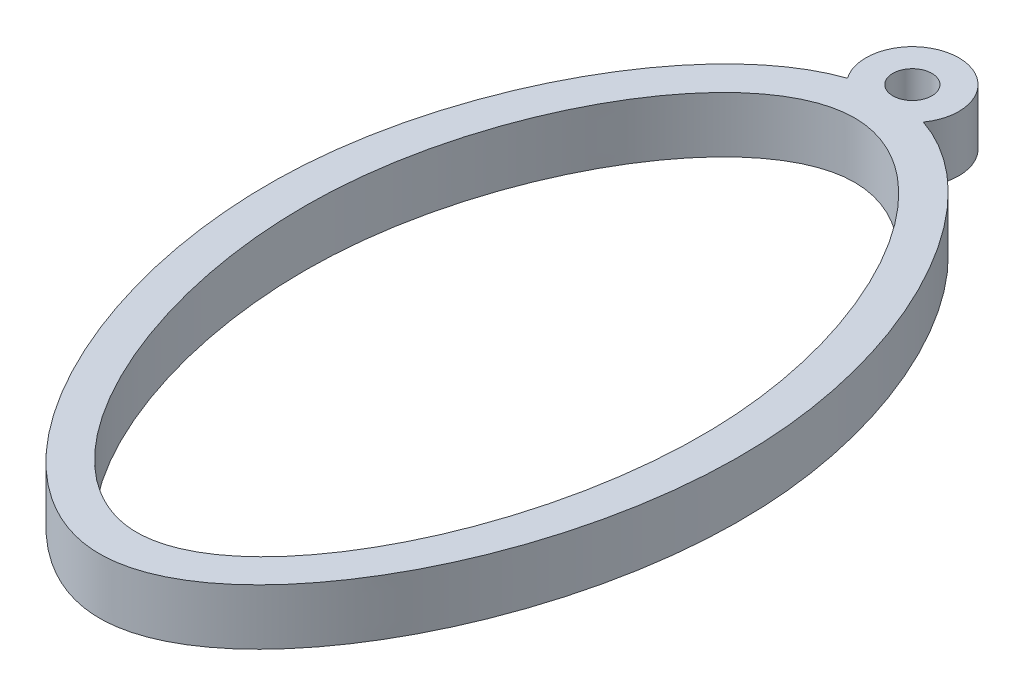
ISO-10303-21;
HEADER;
FILE_DESCRIPTION(('STEP AP214'),'2;1');
FILE_NAME('part.step','',(''),(''),'','','');
FILE_SCHEMA(('AUTOMOTIVE_DESIGN { 1 0 10303 214 1 1 1 1 }'));
ENDSEC;
DATA;
#1=APPLICATION_CONTEXT('core data for automotive mechanical design processes');
#2=APPLICATION_PROTOCOL_DEFINITION('international standard','automotive_design',2000,#1);
#3=PRODUCT_CONTEXT('',#1,'mechanical');
#4=PRODUCT('Part','Part','',(#3));
#5=PRODUCT_RELATED_PRODUCT_CATEGORY('part','',(#4));
#6=PRODUCT_DEFINITION_FORMATION('','',#4);
#7=PRODUCT_DEFINITION_CONTEXT('part definition',#1,'design');
#8=PRODUCT_DEFINITION('design','',#6,#7);
#9=PRODUCT_DEFINITION_SHAPE('','',#8);
#10=(LENGTH_UNIT() NAMED_UNIT(*) SI_UNIT(.MILLI.,.METRE.));
#11=(NAMED_UNIT(*) PLANE_ANGLE_UNIT() SI_UNIT($,.RADIAN.));
#12=(NAMED_UNIT(*) SI_UNIT($,.STERADIAN.) SOLID_ANGLE_UNIT());
#13=UNCERTAINTY_MEASURE_WITH_UNIT(LENGTH_MEASURE(1.E-05),#10,'distance_accuracy_value','');
#14=(GEOMETRIC_REPRESENTATION_CONTEXT(3) GLOBAL_UNCERTAINTY_ASSIGNED_CONTEXT((#13)) GLOBAL_UNIT_ASSIGNED_CONTEXT((#10,
#11,#12)) REPRESENTATION_CONTEXT('',''));
#15=CARTESIAN_POINT('',(0.,0.,0.));
#16=DIRECTION('',(0.,0.,1.));
#17=DIRECTION('',(1.,0.,0.));
#18=AXIS2_PLACEMENT_3D('',#15,#16,#17);
#19=CARTESIAN_POINT('',(0.,3.,-20.47225));
#20=DIRECTION('',(0.,-1.,0.));
#21=DIRECTION('',(0.,0.,-1.));
#22=AXIS2_PLACEMENT_3D('',#19,#20,#21);
#23=CYLINDRICAL_SURFACE('',#22,2.5);
#24=CARTESIAN_POINT('',(0.,0.,-20.47225));
#25=DIRECTION('',(0.,1.,0.));
#26=DIRECTION('',(0.,0.,1.));
#27=AXIS2_PLACEMENT_3D('',#24,#25,#26);
#28=CIRCLE('',#27,2.5);
#29=CARTESIAN_POINT('',(2.03825062251669,0.,-19.0246539238059));
#30=VERTEX_POINT('',#29);
#31=CARTESIAN_POINT('',(-2.03825062251669,0.,-19.0246539238059));
#32=VERTEX_POINT('',#31);
#33=EDGE_CURVE('E62',#30,#32,#28,.T.);
#34=ORIENTED_EDGE('',*,*,#33,.T.);
#35=DIRECTION('',(0.,-1.,0.));
#36=VECTOR('',#35,1.);
#37=CARTESIAN_POINT('',(-2.03825062251669,3.,-19.0246539238059));
#38=LINE('',#37,#36);
#39=CARTESIAN_POINT('',(-2.03825062251669,3.,-19.0246539238059));
#40=VERTEX_POINT('',#39);
#41=EDGE_CURVE('E11',#40,#32,#38,.T.);
#42=ORIENTED_EDGE('',*,*,#41,.F.);
#43=CARTESIAN_POINT('',(0.,3.,-20.47225));
#44=DIRECTION('',(0.,1.,0.));
#45=DIRECTION('',(0.,0.,1.));
#46=AXIS2_PLACEMENT_3D('',#43,#44,#45);
#47=CIRCLE('',#46,2.5);
#48=CARTESIAN_POINT('',(2.03825062251669,3.,-19.0246539238059));
#49=VERTEX_POINT('',#48);
#50=EDGE_CURVE('E64',#49,#40,#47,.T.);
#51=ORIENTED_EDGE('',*,*,#50,.F.);
#52=DIRECTION('',(0.,-1.,0.));
#53=VECTOR('',#52,1.);
#54=CARTESIAN_POINT('',(2.03825062251669,3.,-19.0246539238059));
#55=LINE('',#54,#53);
#56=EDGE_CURVE('E46',#49,#30,#55,.T.);
#57=ORIENTED_EDGE('',*,*,#56,.T.);
#58=EDGE_LOOP('',(#34,#42,#51,#57));
#59=FACE_BOUND('',#58,.T.);
#60=ADVANCED_FACE('F37',(#59),#23,.T.);
#61=CARTESIAN_POINT('',(0.,3.,-19.37225));
#62=CARTESIAN_POINT('',(6.05331774276805,3.,-19.37225));
#63=CARTESIAN_POINT('',(19.0282931466409,3.,0.916515404481379));
#64=CARTESIAN_POINT('',(0.,3.,35.1376154311111));
#65=CARTESIAN_POINT('',(-19.0282931466409,3.,0.916515404481399));
#66=CARTESIAN_POINT('',(-6.05331774276805,3.,-19.37225));
#67=CARTESIAN_POINT('',(0.,3.,-19.37225));
#68=B_SPLINE_CURVE_WITH_KNOTS('',3,(#61,#62,#63,#64,#65,#66,#67),.UNSPECIFIED.,.T.,.F.,(4,1,1,1,
4),(0.,0.233268948662563,0.5,0.766731051337437,1.),.UNSPECIFIED.);
#69=DIRECTION('',(0.,-1.,0.));
#70=VECTOR('',#69,1.);
#71=SURFACE_OF_LINEAR_EXTRUSION('',#68,#70);
#72=CARTESIAN_POINT('',(0.,0.,-19.37225));
#73=CARTESIAN_POINT('',(6.05331774276805,0.,-19.37225));
#74=CARTESIAN_POINT('',(19.0282931466409,0.,0.916515404481379));
#75=CARTESIAN_POINT('',(0.,0.,35.1376154311111));
#76=CARTESIAN_POINT('',(-19.0282931466409,0.,0.916515404481399));
#77=CARTESIAN_POINT('',(-6.05331774276805,0.,-19.37225));
#78=CARTESIAN_POINT('',(0.,0.,-19.37225));
#79=B_SPLINE_CURVE_WITH_KNOTS('',3,(#72,#73,#74,#75,#76,#77,#78),.UNSPECIFIED.,.T.,.F.,(4,1,1,1,
4),(0.,0.233268948662563,0.5,0.766731051337437,1.),.UNSPECIFIED.);
#80=EDGE_CURVE('E70',#30,#32,#79,.T.);
#81=ORIENTED_EDGE('',*,*,#80,.F.);
#82=ORIENTED_EDGE('',*,*,#56,.F.);
#83=EDGE_CURVE('E97',#49,#40,#68,.T.);
#84=ORIENTED_EDGE('',*,*,#83,.T.);
#85=ORIENTED_EDGE('',*,*,#41,.T.);
#86=EDGE_LOOP('',(#81,#82,#84,#85));
#87=FACE_BOUND('',#86,.T.);
#88=ADVANCED_FACE('F73',(#87),#71,.T.);
#89=CARTESIAN_POINT('',(0.,3.,-20.47225));
#90=DIRECTION('',(0.,-1.,0.));
#91=DIRECTION('',(0.,0.,-1.));
#92=AXIS2_PLACEMENT_3D('',#89,#90,#91);
#93=CYLINDRICAL_SURFACE('',#92,1.05);
#94=CARTESIAN_POINT('',(0.,3.,-20.47225));
#95=DIRECTION('',(0.,1.,0.));
#96=DIRECTION('',(0.,0.,1.));
#97=AXIS2_PLACEMENT_3D('',#94,#95,#96);
#98=CIRCLE('',#97,1.05);
#99=CARTESIAN_POINT('',(0.,3.,-19.42225));
#100=VERTEX_POINT('',#99);
#101=EDGE_CURVE('E77',#100,#100,#98,.T.);
#102=ORIENTED_EDGE('',*,*,#101,.T.);
#103=EDGE_LOOP('',(#102));
#104=FACE_BOUND('',#103,.T.);
#105=CARTESIAN_POINT('',(0.,0.,-20.47225));
#106=DIRECTION('',(0.,1.,0.));
#107=DIRECTION('',(0.,0.,1.));
#108=AXIS2_PLACEMENT_3D('',#105,#106,#107);
#109=CIRCLE('',#108,1.05);
#110=CARTESIAN_POINT('',(0.,0.,-19.42225));
#111=VERTEX_POINT('',#110);
#112=EDGE_CURVE('E71',#111,#111,#109,.T.);
#113=ORIENTED_EDGE('',*,*,#112,.F.);
#114=EDGE_LOOP('',(#113));
#115=FACE_BOUND('',#114,.T.);
#116=ADVANCED_FACE('F39',(#104,#115),#93,.F.);
#117=CARTESIAN_POINT('',(0.,3.,-17.37225));
#118=CARTESIAN_POINT('',(5.06534921353784,3.,-17.37225));
#119=CARTESIAN_POINT('',(16.0361387042494,3.,1.02060397780543));
#120=CARTESIAN_POINT('',(0.,3.,32.1126981850092));
#121=CARTESIAN_POINT('',(-16.0361387042494,3.,1.02060397780543));
#122=CARTESIAN_POINT('',(-5.06534921353785,3.,-17.37225));
#123=CARTESIAN_POINT('',(0.,3.,-17.37225));
#124=B_SPLINE_CURVE_WITH_KNOTS('',3,(#117,#118,#119,#120,#121,#122,#123),.UNSPECIFIED.,.T.,.F.,
(4,1,1,1,4),(0.,0.230856184863743,0.5,0.769143815136257,1.),.UNSPECIFIED.);
#125=DIRECTION('',(0.,-1.,0.));
#126=VECTOR('',#125,1.);
#127=SURFACE_OF_LINEAR_EXTRUSION('',#124,#126);
#128=CARTESIAN_POINT('',(0.,3.,-17.37225));
#129=VERTEX_POINT('',#128);
#130=EDGE_CURVE('E66',#129,#129,#124,.T.);
#131=ORIENTED_EDGE('',*,*,#130,.F.);
#132=EDGE_LOOP('',(#131));
#133=FACE_BOUND('',#132,.T.);
#134=CARTESIAN_POINT('',(0.,0.,-17.37225));
#135=CARTESIAN_POINT('',(5.06534921353784,0.,-17.37225));
#136=CARTESIAN_POINT('',(16.0361387042494,0.,1.02060397780543));
#137=CARTESIAN_POINT('',(0.,0.,32.1126981850092));
#138=CARTESIAN_POINT('',(-16.0361387042494,0.,1.02060397780543));
#139=CARTESIAN_POINT('',(-5.06534921353785,0.,-17.37225));
#140=CARTESIAN_POINT('',(0.,0.,-17.37225));
#141=B_SPLINE_CURVE_WITH_KNOTS('',3,(#134,#135,#136,#137,#138,#139,#140),.UNSPECIFIED.,.T.,.F.,
(4,1,1,1,4),(0.,0.230856184863743,0.5,0.769143815136257,1.),.UNSPECIFIED.);
#142=CARTESIAN_POINT('',(0.,0.,-17.37225));
#143=VERTEX_POINT('',#142);
#144=EDGE_CURVE('E74',#143,#143,#141,.T.);
#145=ORIENTED_EDGE('',*,*,#144,.T.);
#146=EDGE_LOOP('',(#145));
#147=FACE_BOUND('',#146,.T.);
#148=ADVANCED_FACE('F106',(#133,#147),#127,.F.);
#149=CARTESIAN_POINT('',(0.,3.,0.));
#150=DIRECTION('',(0.,1.,0.));
#151=DIRECTION('',(0.,0.,1.));
#152=AXIS2_PLACEMENT_3D('',#149,#150,#151);
#153=PLANE('',#152);
#154=ORIENTED_EDGE('',*,*,#101,.F.);
#155=EDGE_LOOP('',(#154));
#156=FACE_BOUND('',#155,.T.);
#157=ORIENTED_EDGE('',*,*,#50,.T.);
#158=ORIENTED_EDGE('',*,*,#83,.F.);
#159=EDGE_LOOP('',(#157,#158));
#160=FACE_BOUND('',#159,.T.);
#161=ORIENTED_EDGE('',*,*,#130,.T.);
#162=EDGE_LOOP('',(#161));
#163=FACE_BOUND('',#162,.T.);
#164=ADVANCED_FACE('F110',(#156,#160,#163),#153,.T.);
#165=CARTESIAN_POINT('',(0.,0.,0.));
#166=DIRECTION('',(0.,1.,0.));
#167=DIRECTION('',(0.,0.,1.));
#168=AXIS2_PLACEMENT_3D('',#165,#166,#167);
#169=PLANE('',#168);
#170=ORIENTED_EDGE('',*,*,#112,.T.);
#171=EDGE_LOOP('',(#170));
#172=FACE_BOUND('',#171,.T.);
#173=ORIENTED_EDGE('',*,*,#33,.F.);
#174=ORIENTED_EDGE('',*,*,#80,.T.);
#175=EDGE_LOOP('',(#173,#174));
#176=FACE_BOUND('',#175,.T.);
#177=ORIENTED_EDGE('',*,*,#144,.F.);
#178=EDGE_LOOP('',(#177));
#179=FACE_BOUND('',#178,.T.);
#180=ADVANCED_FACE('F68',(#172,#176,#179),#169,.F.);
#181=CLOSED_SHELL('',(#60,#88,#116,#148,#164,#180));
#182=MANIFOLD_SOLID_BREP('B2',#181);
#183=ADVANCED_BREP_SHAPE_REPRESENTATION('',(#18,#182),#14);
#184=SHAPE_DEFINITION_REPRESENTATION(#9,#183);
ENDSEC;
END-ISO-10303-21;
